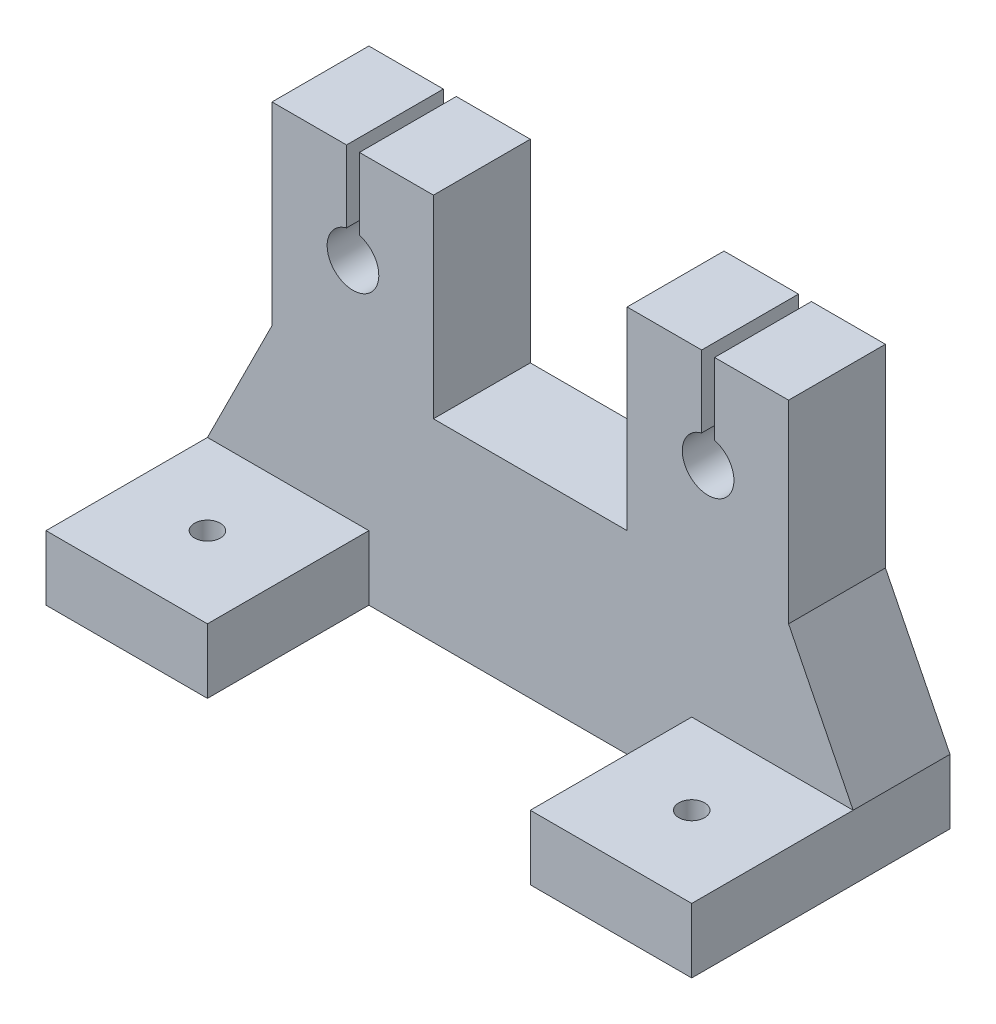
ISO-10303-21;
HEADER;
FILE_DESCRIPTION(('STEP AP214'),'2;1');
FILE_NAME('part.step','',(''),(''),'','','');
FILE_SCHEMA(('AUTOMOTIVE_DESIGN { 1 0 10303 214 1 1 1 1 }'));
ENDSEC;
DATA;
#1=APPLICATION_CONTEXT('core data for automotive mechanical design processes');
#2=APPLICATION_PROTOCOL_DEFINITION('international standard','automotive_design',2000,#1);
#3=PRODUCT_CONTEXT('',#1,'mechanical');
#4=PRODUCT('Part','Part','',(#3));
#5=PRODUCT_RELATED_PRODUCT_CATEGORY('part','',(#4));
#6=PRODUCT_DEFINITION_FORMATION('','',#4);
#7=PRODUCT_DEFINITION_CONTEXT('part definition',#1,'design');
#8=PRODUCT_DEFINITION('design','',#6,#7);
#9=PRODUCT_DEFINITION_SHAPE('','',#8);
#10=(LENGTH_UNIT() NAMED_UNIT(*) SI_UNIT(.MILLI.,.METRE.));
#11=(NAMED_UNIT(*) PLANE_ANGLE_UNIT() SI_UNIT($,.RADIAN.));
#12=(NAMED_UNIT(*) SI_UNIT($,.STERADIAN.) SOLID_ANGLE_UNIT());
#13=UNCERTAINTY_MEASURE_WITH_UNIT(LENGTH_MEASURE(1.E-05),#10,'distance_accuracy_value','');
#14=(GEOMETRIC_REPRESENTATION_CONTEXT(3) GLOBAL_UNCERTAINTY_ASSIGNED_CONTEXT((#13)) GLOBAL_UNIT_ASSIGNED_CONTEXT((#10,
#11,#12)) REPRESENTATION_CONTEXT('',''));
#15=CARTESIAN_POINT('',(0.,0.,0.));
#16=DIRECTION('',(0.,0.,1.));
#17=DIRECTION('',(1.,0.,0.));
#18=AXIS2_PLACEMENT_3D('',#15,#16,#17);
#19=CARTESIAN_POINT('',(27.5400295448925,15.,0.));
#20=DIRECTION('',(0.,0.,1.));
#21=DIRECTION('',(1.,0.,0.));
#22=AXIS2_PLACEMENT_3D('',#19,#20,#21);
#23=PLANE('',#22);
#24=DIRECTION('',(0.,-1.,0.));
#25=VECTOR('',#24,1.);
#26=CARTESIAN_POINT('',(25.,-20.,0.));
#27=LINE('',#26,#25);
#28=CARTESIAN_POINT('',(25.,-20.,0.));
#29=VERTEX_POINT('',#28);
#30=CARTESIAN_POINT('',(25.,-30.,0.));
#31=VERTEX_POINT('',#30);
#32=EDGE_CURVE('E55',#29,#31,#27,.T.);
#33=ORIENTED_EDGE('',*,*,#32,.F.);
#34=DIRECTION('',(-1.,0.,0.));
#35=VECTOR('',#34,1.);
#36=CARTESIAN_POINT('',(50.,-20.,0.));
#37=LINE('',#36,#35);
#38=CARTESIAN_POINT('',(50.,-20.,0.));
#39=VERTEX_POINT('',#38);
#40=EDGE_CURVE('E467',#39,#29,#37,.T.);
#41=ORIENTED_EDGE('',*,*,#40,.F.);
#42=DIRECTION('',(-0.447213595499958,0.894427190999916,0.));
#43=VECTOR('',#42,1.);
#44=CARTESIAN_POINT('',(40.,0.,0.));
#45=LINE('',#44,#43);
#46=CARTESIAN_POINT('',(40.,0.,0.));
#47=VERTEX_POINT('',#46);
#48=EDGE_CURVE('E345',#39,#47,#45,.T.);
#49=ORIENTED_EDGE('',*,*,#48,.T.);
#50=DIRECTION('',(0.,1.,0.));
#51=VECTOR('',#50,1.);
#52=CARTESIAN_POINT('',(40.,0.,0.));
#53=LINE('',#52,#51);
#54=CARTESIAN_POINT('',(40.,30.,0.));
#55=VERTEX_POINT('',#54);
#56=EDGE_CURVE('E348',#47,#55,#53,.T.);
#57=ORIENTED_EDGE('',*,*,#56,.T.);
#58=DIRECTION('',(-1.,0.,0.));
#59=VECTOR('',#58,1.);
#60=CARTESIAN_POINT('',(28.5400295448926,30.,0.));
#61=LINE('',#60,#59);
#62=CARTESIAN_POINT('',(28.5400295448926,30.,0.));
#63=VERTEX_POINT('',#62);
#64=EDGE_CURVE('E351',#55,#63,#61,.T.);
#65=ORIENTED_EDGE('',*,*,#64,.T.);
#66=DIRECTION('',(0.,-1.,0.));
#67=VECTOR('',#66,1.);
#68=CARTESIAN_POINT('',(28.5400295448926,30.,0.));
#69=LINE('',#68,#67);
#70=CARTESIAN_POINT('',(28.5400295448926,18.8729833462074,0.));
#71=VERTEX_POINT('',#70);
#72=EDGE_CURVE('E354',#63,#71,#69,.T.);
#73=ORIENTED_EDGE('',*,*,#72,.T.);
#74=CARTESIAN_POINT('',(27.5400295448925,15.,0.));
#75=DIRECTION('',(0.,0.,-1.));
#76=DIRECTION('',(1.,0.,0.));
#77=AXIS2_PLACEMENT_3D('',#74,#75,#76);
#78=CIRCLE('',#77,4.00000000000001);
#79=CARTESIAN_POINT('',(26.5400295448926,18.8729833462074,0.));
#80=VERTEX_POINT('',#79);
#81=EDGE_CURVE('E357',#71,#80,#78,.T.);
#82=ORIENTED_EDGE('',*,*,#81,.T.);
#83=DIRECTION('',(0.,1.,0.));
#84=VECTOR('',#83,1.);
#85=CARTESIAN_POINT('',(26.5400295448926,30.,0.));
#86=LINE('',#85,#84);
#87=CARTESIAN_POINT('',(26.5400295448926,30.,0.));
#88=VERTEX_POINT('',#87);
#89=EDGE_CURVE('E360',#80,#88,#86,.T.);
#90=ORIENTED_EDGE('',*,*,#89,.T.);
#91=DIRECTION('',(-1.,0.,0.));
#92=VECTOR('',#91,1.);
#93=CARTESIAN_POINT('',(15.,30.,0.));
#94=LINE('',#93,#92);
#95=CARTESIAN_POINT('',(15.,30.,0.));
#96=VERTEX_POINT('',#95);
#97=EDGE_CURVE('E363',#88,#96,#94,.T.);
#98=ORIENTED_EDGE('',*,*,#97,.T.);
#99=DIRECTION('',(0.,-1.,0.));
#100=VECTOR('',#99,1.);
#101=CARTESIAN_POINT('',(15.,0.,0.));
#102=LINE('',#101,#100);
#103=CARTESIAN_POINT('',(15.,0.,0.));
#104=VERTEX_POINT('',#103);
#105=EDGE_CURVE('E263',#96,#104,#102,.T.);
#106=ORIENTED_EDGE('',*,*,#105,.T.);
#107=DIRECTION('',(-1.,0.,0.));
#108=VECTOR('',#107,1.);
#109=CARTESIAN_POINT('',(-15.,0.,0.));
#110=LINE('',#109,#108);
#111=CARTESIAN_POINT('',(-15.,0.,0.));
#112=VERTEX_POINT('',#111);
#113=EDGE_CURVE('E259',#104,#112,#110,.T.);
#114=ORIENTED_EDGE('',*,*,#113,.T.);
#115=DIRECTION('',(0.,1.,0.));
#116=VECTOR('',#115,1.);
#117=CARTESIAN_POINT('',(-15.,0.,0.));
#118=LINE('',#117,#116);
#119=CARTESIAN_POINT('',(-15.,30.,0.));
#120=VERTEX_POINT('',#119);
#121=EDGE_CURVE('E320',#112,#120,#118,.T.);
#122=ORIENTED_EDGE('',*,*,#121,.T.);
#123=DIRECTION('',(-1.,0.,0.));
#124=VECTOR('',#123,1.);
#125=CARTESIAN_POINT('',(-26.4599704551074,30.,0.));
#126=LINE('',#125,#124);
#127=CARTESIAN_POINT('',(-26.4599704551074,30.,0.));
#128=VERTEX_POINT('',#127);
#129=EDGE_CURVE('E323',#120,#128,#126,.T.);
#130=ORIENTED_EDGE('',*,*,#129,.T.);
#131=DIRECTION('',(0.,-1.,0.));
#132=VECTOR('',#131,1.);
#133=CARTESIAN_POINT('',(-26.4599704551074,30.,0.));
#134=LINE('',#133,#132);
#135=CARTESIAN_POINT('',(-26.4599704551074,18.8729833462074,0.));
#136=VERTEX_POINT('',#135);
#137=EDGE_CURVE('E326',#128,#136,#134,.T.);
#138=ORIENTED_EDGE('',*,*,#137,.T.);
#139=CARTESIAN_POINT('',(-27.4599704551074,15.,0.));
#140=DIRECTION('',(0.,0.,-1.));
#141=DIRECTION('',(1.,0.,0.));
#142=AXIS2_PLACEMENT_3D('',#139,#140,#141);
#143=CIRCLE('',#142,4.);
#144=CARTESIAN_POINT('',(-28.4599704551074,18.8729833462074,0.));
#145=VERTEX_POINT('',#144);
#146=EDGE_CURVE('E329',#136,#145,#143,.T.);
#147=ORIENTED_EDGE('',*,*,#146,.T.);
#148=DIRECTION('',(0.,1.,0.));
#149=VECTOR('',#148,1.);
#150=CARTESIAN_POINT('',(-28.4599704551074,30.,0.));
#151=LINE('',#150,#149);
#152=CARTESIAN_POINT('',(-28.4599704551074,30.,0.));
#153=VERTEX_POINT('',#152);
#154=EDGE_CURVE('E332',#145,#153,#151,.T.);
#155=ORIENTED_EDGE('',*,*,#154,.T.);
#156=DIRECTION('',(-1.,0.,0.));
#157=VECTOR('',#156,1.);
#158=CARTESIAN_POINT('',(-40.,30.,0.));
#159=LINE('',#158,#157);
#160=CARTESIAN_POINT('',(-40.,30.,0.));
#161=VERTEX_POINT('',#160);
#162=EDGE_CURVE('E335',#153,#161,#159,.T.);
#163=ORIENTED_EDGE('',*,*,#162,.T.);
#164=DIRECTION('',(0.,-1.,0.));
#165=VECTOR('',#164,1.);
#166=CARTESIAN_POINT('',(-40.,0.,0.));
#167=LINE('',#166,#165);
#168=CARTESIAN_POINT('',(-40.,0.,0.));
#169=VERTEX_POINT('',#168);
#170=EDGE_CURVE('E338',#161,#169,#167,.T.);
#171=ORIENTED_EDGE('',*,*,#170,.T.);
#172=DIRECTION('',(-0.447213595499958,-0.894427190999916,0.));
#173=VECTOR('',#172,1.);
#174=CARTESIAN_POINT('',(-50.,-20.,0.));
#175=LINE('',#174,#173);
#176=CARTESIAN_POINT('',(-50.,-20.,0.));
#177=VERTEX_POINT('',#176);
#178=EDGE_CURVE('E341',#169,#177,#175,.T.);
#179=ORIENTED_EDGE('',*,*,#178,.T.);
#180=DIRECTION('',(-1.,0.,0.));
#181=VECTOR('',#180,1.);
#182=CARTESIAN_POINT('',(-50.,-20.,0.));
#183=LINE('',#182,#181);
#184=CARTESIAN_POINT('',(-25.,-20.,0.));
#185=VERTEX_POINT('',#184);
#186=EDGE_CURVE('E233',#185,#177,#183,.T.);
#187=ORIENTED_EDGE('',*,*,#186,.F.);
#188=DIRECTION('',(0.,1.,0.));
#189=VECTOR('',#188,1.);
#190=CARTESIAN_POINT('',(-25.,-20.,0.));
#191=LINE('',#190,#189);
#192=CARTESIAN_POINT('',(-25.,-30.,0.));
#193=VERTEX_POINT('',#192);
#194=EDGE_CURVE('E230',#193,#185,#191,.T.);
#195=ORIENTED_EDGE('',*,*,#194,.F.);
#196=DIRECTION('',(1.,0.,0.));
#197=VECTOR('',#196,1.);
#198=CARTESIAN_POINT('',(50.,-30.,0.));
#199=LINE('',#198,#197);
#200=EDGE_CURVE('E60',#193,#31,#199,.T.);
#201=ORIENTED_EDGE('',*,*,#200,.T.);
#202=EDGE_LOOP('',(#33,#41,#49,#57,#65,#73,#82,#90,#98,#106,#114,#122,#130,#138,#147,#155,#163,
#171,#179,#187,#195,#201));
#203=FACE_BOUND('',#202,.T.);
#204=ADVANCED_FACE('F38',(#203),#23,.T.);
#205=CARTESIAN_POINT('',(15.,0.,-15.));
#206=DIRECTION('',(-1.,0.,0.));
#207=DIRECTION('',(0.,0.,1.));
#208=AXIS2_PLACEMENT_3D('',#205,#206,#207);
#209=PLANE('',#208);
#210=ORIENTED_EDGE('',*,*,#105,.F.);
#211=DIRECTION('',(0.,0.,1.));
#212=VECTOR('',#211,1.);
#213=CARTESIAN_POINT('',(15.,30.,-15.));
#214=LINE('',#213,#212);
#215=CARTESIAN_POINT('',(15.,30.,-15.));
#216=VERTEX_POINT('',#215);
#217=EDGE_CURVE('E47',#216,#96,#214,.T.);
#218=ORIENTED_EDGE('',*,*,#217,.F.);
#219=DIRECTION('',(0.,-1.,0.));
#220=VECTOR('',#219,1.);
#221=CARTESIAN_POINT('',(15.,0.,-15.));
#222=LINE('',#221,#220);
#223=CARTESIAN_POINT('',(15.,0.,-15.));
#224=VERTEX_POINT('',#223);
#225=EDGE_CURVE('E315',#216,#224,#222,.T.);
#226=ORIENTED_EDGE('',*,*,#225,.T.);
#227=DIRECTION('',(0.,0.,1.));
#228=VECTOR('',#227,1.);
#229=CARTESIAN_POINT('',(15.,0.,-15.));
#230=LINE('',#229,#228);
#231=EDGE_CURVE('E11',#224,#104,#230,.T.);
#232=ORIENTED_EDGE('',*,*,#231,.T.);
#233=EDGE_LOOP('',(#210,#218,#226,#232));
#234=FACE_BOUND('',#233,.T.);
#235=ADVANCED_FACE('F411',(#234),#209,.T.);
#236=CARTESIAN_POINT('',(15.,30.,-15.));
#237=DIRECTION('',(0.,1.,0.));
#238=DIRECTION('',(0.,0.,1.));
#239=AXIS2_PLACEMENT_3D('',#236,#237,#238);
#240=PLANE('',#239);
#241=ORIENTED_EDGE('',*,*,#97,.F.);
#242=DIRECTION('',(0.,0.,1.));
#243=VECTOR('',#242,1.);
#244=CARTESIAN_POINT('',(26.5400295448926,30.,-15.));
#245=LINE('',#244,#243);
#246=CARTESIAN_POINT('',(26.5400295448926,30.,-15.));
#247=VERTEX_POINT('',#246);
#248=EDGE_CURVE('E369',#247,#88,#245,.T.);
#249=ORIENTED_EDGE('',*,*,#248,.F.);
#250=DIRECTION('',(-1.,0.,0.));
#251=VECTOR('',#250,1.);
#252=CARTESIAN_POINT('',(15.,30.,-15.));
#253=LINE('',#252,#251);
#254=EDGE_CURVE('E312',#247,#216,#253,.T.);
#255=ORIENTED_EDGE('',*,*,#254,.T.);
#256=ORIENTED_EDGE('',*,*,#217,.T.);
#257=EDGE_LOOP('',(#241,#249,#255,#256));
#258=FACE_BOUND('',#257,.T.);
#259=ADVANCED_FACE('F505',(#258),#240,.T.);
#260=CARTESIAN_POINT('',(26.5400295448926,30.,-15.));
#261=DIRECTION('',(1.,0.,0.));
#262=DIRECTION('',(0.,0.,-1.));
#263=AXIS2_PLACEMENT_3D('',#260,#261,#262);
#264=PLANE('',#263);
#265=ORIENTED_EDGE('',*,*,#89,.F.);
#266=DIRECTION('',(0.,0.,1.));
#267=VECTOR('',#266,1.);
#268=CARTESIAN_POINT('',(26.5400295448926,18.8729833462074,-15.));
#269=LINE('',#268,#267);
#270=CARTESIAN_POINT('',(26.5400295448926,18.8729833462074,-15.));
#271=VERTEX_POINT('',#270);
#272=EDGE_CURVE('E371',#271,#80,#269,.T.);
#273=ORIENTED_EDGE('',*,*,#272,.F.);
#274=DIRECTION('',(0.,1.,0.));
#275=VECTOR('',#274,1.);
#276=CARTESIAN_POINT('',(26.5400295448926,30.,-15.));
#277=LINE('',#276,#275);
#278=EDGE_CURVE('E309',#271,#247,#277,.T.);
#279=ORIENTED_EDGE('',*,*,#278,.T.);
#280=ORIENTED_EDGE('',*,*,#248,.T.);
#281=EDGE_LOOP('',(#265,#273,#279,#280));
#282=FACE_BOUND('',#281,.T.);
#283=ADVANCED_FACE('F511',(#282),#264,.T.);
#284=CARTESIAN_POINT('',(27.5400295448925,15.,-15.));
#285=DIRECTION('',(0.,0.,1.));
#286=DIRECTION('',(1.,0.,0.));
#287=AXIS2_PLACEMENT_3D('',#284,#285,#286);
#288=CYLINDRICAL_SURFACE('',#287,4.00000000000001);
#289=ORIENTED_EDGE('',*,*,#81,.F.);
#290=DIRECTION('',(0.,0.,1.));
#291=VECTOR('',#290,1.);
#292=CARTESIAN_POINT('',(28.5400295448926,18.8729833462074,-15.));
#293=LINE('',#292,#291);
#294=CARTESIAN_POINT('',(28.5400295448926,18.8729833462074,-15.));
#295=VERTEX_POINT('',#294);
#296=EDGE_CURVE('E373',#295,#71,#293,.T.);
#297=ORIENTED_EDGE('',*,*,#296,.F.);
#298=CARTESIAN_POINT('',(27.5400295448925,15.,-15.));
#299=DIRECTION('',(0.,0.,-1.));
#300=DIRECTION('',(1.,0.,0.));
#301=AXIS2_PLACEMENT_3D('',#298,#299,#300);
#302=CIRCLE('',#301,4.00000000000001);
#303=EDGE_CURVE('E306',#295,#271,#302,.T.);
#304=ORIENTED_EDGE('',*,*,#303,.T.);
#305=ORIENTED_EDGE('',*,*,#272,.T.);
#306=EDGE_LOOP('',(#289,#297,#304,#305));
#307=FACE_BOUND('',#306,.T.);
#308=ADVANCED_FACE('F515',(#307),#288,.F.);
#309=CARTESIAN_POINT('',(28.5400295448926,30.,-15.));
#310=DIRECTION('',(-1.,0.,0.));
#311=DIRECTION('',(0.,0.,1.));
#312=AXIS2_PLACEMENT_3D('',#309,#310,#311);
#313=PLANE('',#312);
#314=ORIENTED_EDGE('',*,*,#72,.F.);
#315=DIRECTION('',(0.,0.,1.));
#316=VECTOR('',#315,1.);
#317=CARTESIAN_POINT('',(28.5400295448926,30.,-15.));
#318=LINE('',#317,#316);
#319=CARTESIAN_POINT('',(28.5400295448926,30.,-15.));
#320=VERTEX_POINT('',#319);
#321=EDGE_CURVE('E375',#320,#63,#318,.T.);
#322=ORIENTED_EDGE('',*,*,#321,.F.);
#323=DIRECTION('',(0.,-1.,0.));
#324=VECTOR('',#323,1.);
#325=CARTESIAN_POINT('',(28.5400295448926,30.,-15.));
#326=LINE('',#325,#324);
#327=EDGE_CURVE('E303',#320,#295,#326,.T.);
#328=ORIENTED_EDGE('',*,*,#327,.T.);
#329=ORIENTED_EDGE('',*,*,#296,.T.);
#330=EDGE_LOOP('',(#314,#322,#328,#329));
#331=FACE_BOUND('',#330,.T.);
#332=ADVANCED_FACE('F519',(#331),#313,.T.);
#333=CARTESIAN_POINT('',(28.5400295448926,30.,-15.));
#334=DIRECTION('',(0.,1.,0.));
#335=DIRECTION('',(0.,0.,1.));
#336=AXIS2_PLACEMENT_3D('',#333,#334,#335);
#337=PLANE('',#336);
#338=ORIENTED_EDGE('',*,*,#64,.F.);
#339=DIRECTION('',(0.,0.,1.));
#340=VECTOR('',#339,1.);
#341=CARTESIAN_POINT('',(40.,30.,-15.));
#342=LINE('',#341,#340);
#343=CARTESIAN_POINT('',(40.,30.,-15.));
#344=VERTEX_POINT('',#343);
#345=EDGE_CURVE('E377',#344,#55,#342,.T.);
#346=ORIENTED_EDGE('',*,*,#345,.F.);
#347=DIRECTION('',(-1.,0.,0.));
#348=VECTOR('',#347,1.);
#349=CARTESIAN_POINT('',(28.5400295448926,30.,-15.));
#350=LINE('',#349,#348);
#351=EDGE_CURVE('E300',#344,#320,#350,.T.);
#352=ORIENTED_EDGE('',*,*,#351,.T.);
#353=ORIENTED_EDGE('',*,*,#321,.T.);
#354=EDGE_LOOP('',(#338,#346,#352,#353));
#355=FACE_BOUND('',#354,.T.);
#356=ADVANCED_FACE('F523',(#355),#337,.T.);
#357=CARTESIAN_POINT('',(40.,0.,-15.));
#358=DIRECTION('',(1.,0.,0.));
#359=DIRECTION('',(0.,0.,-1.));
#360=AXIS2_PLACEMENT_3D('',#357,#358,#359);
#361=PLANE('',#360);
#362=ORIENTED_EDGE('',*,*,#56,.F.);
#363=DIRECTION('',(0.,0.,1.));
#364=VECTOR('',#363,1.);
#365=CARTESIAN_POINT('',(40.,0.,-15.));
#366=LINE('',#365,#364);
#367=CARTESIAN_POINT('',(40.,0.,-15.));
#368=VERTEX_POINT('',#367);
#369=EDGE_CURVE('E379',#368,#47,#366,.T.);
#370=ORIENTED_EDGE('',*,*,#369,.F.);
#371=DIRECTION('',(0.,1.,0.));
#372=VECTOR('',#371,1.);
#373=CARTESIAN_POINT('',(40.,0.,-15.));
#374=LINE('',#373,#372);
#375=EDGE_CURVE('E297',#368,#344,#374,.T.);
#376=ORIENTED_EDGE('',*,*,#375,.T.);
#377=ORIENTED_EDGE('',*,*,#345,.T.);
#378=EDGE_LOOP('',(#362,#370,#376,#377));
#379=FACE_BOUND('',#378,.T.);
#380=ADVANCED_FACE('F527',(#379),#361,.T.);
#381=CARTESIAN_POINT('',(40.,0.,-15.));
#382=DIRECTION('',(0.894427190999916,0.447213595499958,0.));
#383=DIRECTION('',(-0.447213595499958,0.894427190999916,0.));
#384=AXIS2_PLACEMENT_3D('',#381,#382,#383);
#385=PLANE('',#384);
#386=ORIENTED_EDGE('',*,*,#48,.F.);
#387=DIRECTION('',(0.,0.,1.));
#388=VECTOR('',#387,1.);
#389=CARTESIAN_POINT('',(50.,-20.,-15.));
#390=LINE('',#389,#388);
#391=CARTESIAN_POINT('',(50.,-20.,-15.));
#392=VERTEX_POINT('',#391);
#393=EDGE_CURVE('E228',#392,#39,#390,.T.);
#394=ORIENTED_EDGE('',*,*,#393,.F.);
#395=DIRECTION('',(-0.447213595499958,0.894427190999916,0.));
#396=VECTOR('',#395,1.);
#397=CARTESIAN_POINT('',(40.,0.,-15.));
#398=LINE('',#397,#396);
#399=EDGE_CURVE('E294',#392,#368,#398,.T.);
#400=ORIENTED_EDGE('',*,*,#399,.T.);
#401=ORIENTED_EDGE('',*,*,#369,.T.);
#402=EDGE_LOOP('',(#386,#394,#400,#401));
#403=FACE_BOUND('',#402,.T.);
#404=ADVANCED_FACE('F531',(#403),#385,.T.);
#405=CARTESIAN_POINT('',(50.,-20.,-15.));
#406=DIRECTION('',(1.,0.,0.));
#407=DIRECTION('',(0.,1.,0.));
#408=AXIS2_PLACEMENT_3D('',#405,#406,#407);
#409=PLANE('',#408);
#410=ORIENTED_EDGE('',*,*,#393,.T.);
#411=DIRECTION('',(0.,0.,-1.));
#412=VECTOR('',#411,1.);
#413=CARTESIAN_POINT('',(50.,-20.,25.));
#414=LINE('',#413,#412);
#415=CARTESIAN_POINT('',(50.,-20.,25.));
#416=VERTEX_POINT('',#415);
#417=EDGE_CURVE('E209',#416,#39,#414,.T.);
#418=ORIENTED_EDGE('',*,*,#417,.F.);
#419=DIRECTION('',(0.,1.,0.));
#420=VECTOR('',#419,1.);
#421=CARTESIAN_POINT('',(50.,-30.,25.));
#422=LINE('',#421,#420);
#423=CARTESIAN_POINT('',(50.,-30.,25.));
#424=VERTEX_POINT('',#423);
#425=EDGE_CURVE('E215',#424,#416,#422,.T.);
#426=ORIENTED_EDGE('',*,*,#425,.F.);
#427=DIRECTION('',(0.,0.,1.));
#428=VECTOR('',#427,1.);
#429=CARTESIAN_POINT('',(50.,-30.,-15.));
#430=LINE('',#429,#428);
#431=CARTESIAN_POINT('',(50.,-30.,-15.));
#432=VERTEX_POINT('',#431);
#433=EDGE_CURVE('E382',#432,#424,#430,.T.);
#434=ORIENTED_EDGE('',*,*,#433,.F.);
#435=DIRECTION('',(0.,1.,0.));
#436=VECTOR('',#435,1.);
#437=CARTESIAN_POINT('',(50.,-20.,-15.));
#438=LINE('',#437,#436);
#439=EDGE_CURVE('E292',#432,#392,#438,.T.);
#440=ORIENTED_EDGE('',*,*,#439,.T.);
#441=EDGE_LOOP('',(#410,#418,#426,#434,#440));
#442=FACE_BOUND('',#441,.T.);
#443=ADVANCED_FACE('F226',(#442),#409,.T.);
#444=CARTESIAN_POINT('',(50.,-30.,-15.));
#445=DIRECTION('',(0.,-1.,0.));
#446=DIRECTION('',(1.,0.,0.));
#447=AXIS2_PLACEMENT_3D('',#444,#445,#446);
#448=PLANE('',#447);
#449=CARTESIAN_POINT('',(-37.5,-30.,12.5));
#450=DIRECTION('',(0.,1.,0.));
#451=DIRECTION('',(0.,0.,1.));
#452=AXIS2_PLACEMENT_3D('',#449,#450,#451);
#453=CIRCLE('',#452,2.);
#454=CARTESIAN_POINT('',(-37.5,-30.,14.5));
#455=VERTEX_POINT('',#454);
#456=EDGE_CURVE('E468',#455,#455,#453,.T.);
#457=ORIENTED_EDGE('',*,*,#456,.T.);
#458=EDGE_LOOP('',(#457));
#459=FACE_BOUND('',#458,.T.);
#460=CARTESIAN_POINT('',(37.5,-30.,12.5));
#461=DIRECTION('',(0.,1.,0.));
#462=DIRECTION('',(0.,0.,1.));
#463=AXIS2_PLACEMENT_3D('',#460,#461,#462);
#464=CIRCLE('',#463,2.);
#465=CARTESIAN_POINT('',(37.5,-30.,14.5));
#466=VERTEX_POINT('',#465);
#467=EDGE_CURVE('E474',#466,#466,#464,.T.);
#468=ORIENTED_EDGE('',*,*,#467,.T.);
#469=EDGE_LOOP('',(#468));
#470=FACE_BOUND('',#469,.T.);
#471=ORIENTED_EDGE('',*,*,#200,.F.);
#472=DIRECTION('',(0.,0.,-1.));
#473=VECTOR('',#472,1.);
#474=CARTESIAN_POINT('',(-25.,-30.,25.));
#475=LINE('',#474,#473);
#476=CARTESIAN_POINT('',(-25.,-30.,25.));
#477=VERTEX_POINT('',#476);
#478=EDGE_CURVE('E256',#477,#193,#475,.T.);
#479=ORIENTED_EDGE('',*,*,#478,.F.);
#480=DIRECTION('',(1.,0.,0.));
#481=VECTOR('',#480,1.);
#482=CARTESIAN_POINT('',(-50.,-30.,25.));
#483=LINE('',#482,#481);
#484=CARTESIAN_POINT('',(-50.,-30.,25.));
#485=VERTEX_POINT('',#484);
#486=EDGE_CURVE('E242',#485,#477,#483,.T.);
#487=ORIENTED_EDGE('',*,*,#486,.F.);
#488=DIRECTION('',(0.,0.,1.));
#489=VECTOR('',#488,1.);
#490=CARTESIAN_POINT('',(-50.,-30.,-15.));
#491=LINE('',#490,#489);
#492=CARTESIAN_POINT('',(-50.,-30.,-15.));
#493=VERTEX_POINT('',#492);
#494=EDGE_CURVE('E384',#493,#485,#491,.T.);
#495=ORIENTED_EDGE('',*,*,#494,.F.);
#496=DIRECTION('',(1.,0.,0.));
#497=VECTOR('',#496,1.);
#498=CARTESIAN_POINT('',(0.,-30.,-15.));
#499=LINE('',#498,#497);
#500=EDGE_CURVE('E290',#493,#432,#499,.T.);
#501=ORIENTED_EDGE('',*,*,#500,.T.);
#502=ORIENTED_EDGE('',*,*,#433,.T.);
#503=DIRECTION('',(1.,0.,0.));
#504=VECTOR('',#503,1.);
#505=CARTESIAN_POINT('',(25.,-30.,25.));
#506=LINE('',#505,#504);
#507=CARTESIAN_POINT('',(25.,-30.,25.));
#508=VERTEX_POINT('',#507);
#509=EDGE_CURVE('E221',#508,#424,#506,.T.);
#510=ORIENTED_EDGE('',*,*,#509,.F.);
#511=DIRECTION('',(0.,0.,-1.));
#512=VECTOR('',#511,1.);
#513=CARTESIAN_POINT('',(25.,-30.,25.));
#514=LINE('',#513,#512);
#515=EDGE_CURVE('E235',#508,#31,#514,.T.);
#516=ORIENTED_EDGE('',*,*,#515,.T.);
#517=EDGE_LOOP('',(#471,#479,#487,#495,#501,#502,#510,#516));
#518=FACE_BOUND('',#517,.T.);
#519=ADVANCED_FACE('F461',(#459,#470,#518),#448,.T.);
#520=CARTESIAN_POINT('',(-50.,-30.,-15.));
#521=DIRECTION('',(-1.,0.,0.));
#522=DIRECTION('',(0.,0.,1.));
#523=AXIS2_PLACEMENT_3D('',#520,#521,#522);
#524=PLANE('',#523);
#525=ORIENTED_EDGE('',*,*,#494,.T.);
#526=DIRECTION('',(0.,-1.,0.));
#527=VECTOR('',#526,1.);
#528=CARTESIAN_POINT('',(-50.,-20.,25.));
#529=LINE('',#528,#527);
#530=CARTESIAN_POINT('',(-50.,-20.,25.));
#531=VERTEX_POINT('',#530);
#532=EDGE_CURVE('E239',#531,#485,#529,.T.);
#533=ORIENTED_EDGE('',*,*,#532,.F.);
#534=DIRECTION('',(0.,0.,-1.));
#535=VECTOR('',#534,1.);
#536=CARTESIAN_POINT('',(-50.,-20.,25.));
#537=LINE('',#536,#535);
#538=EDGE_CURVE('E247',#531,#177,#537,.T.);
#539=ORIENTED_EDGE('',*,*,#538,.T.);
#540=DIRECTION('',(0.,0.,1.));
#541=VECTOR('',#540,1.);
#542=CARTESIAN_POINT('',(-50.,-20.,-15.));
#543=LINE('',#542,#541);
#544=CARTESIAN_POINT('',(-50.,-20.,-15.));
#545=VERTEX_POINT('',#544);
#546=EDGE_CURVE('E386',#545,#177,#543,.T.);
#547=ORIENTED_EDGE('',*,*,#546,.F.);
#548=DIRECTION('',(0.,-1.,0.));
#549=VECTOR('',#548,1.);
#550=CARTESIAN_POINT('',(-50.,-30.,-15.));
#551=LINE('',#550,#549);
#552=EDGE_CURVE('E287',#545,#493,#551,.T.);
#553=ORIENTED_EDGE('',*,*,#552,.T.);
#554=EDGE_LOOP('',(#525,#533,#539,#547,#553));
#555=FACE_BOUND('',#554,.T.);
#556=ADVANCED_FACE('F450',(#555),#524,.T.);
#557=CARTESIAN_POINT('',(-50.,-20.,-15.));
#558=DIRECTION('',(-0.894427190999916,0.447213595499958,0.));
#559=DIRECTION('',(-0.447213595499958,-0.894427190999916,0.));
#560=AXIS2_PLACEMENT_3D('',#557,#558,#559);
#561=PLANE('',#560);
#562=ORIENTED_EDGE('',*,*,#178,.F.);
#563=DIRECTION('',(0.,0.,1.));
#564=VECTOR('',#563,1.);
#565=CARTESIAN_POINT('',(-40.,0.,-15.));
#566=LINE('',#565,#564);
#567=CARTESIAN_POINT('',(-40.,0.,-15.));
#568=VERTEX_POINT('',#567);
#569=EDGE_CURVE('E388',#568,#169,#566,.T.);
#570=ORIENTED_EDGE('',*,*,#569,.F.);
#571=DIRECTION('',(-0.447213595499958,-0.894427190999916,0.));
#572=VECTOR('',#571,1.);
#573=CARTESIAN_POINT('',(-50.,-20.,-15.));
#574=LINE('',#573,#572);
#575=EDGE_CURVE('E284',#568,#545,#574,.T.);
#576=ORIENTED_EDGE('',*,*,#575,.T.);
#577=ORIENTED_EDGE('',*,*,#546,.T.);
#578=EDGE_LOOP('',(#562,#570,#576,#577));
#579=FACE_BOUND('',#578,.T.);
#580=ADVANCED_FACE('F442',(#579),#561,.T.);
#581=CARTESIAN_POINT('',(-40.,0.,-15.));
#582=DIRECTION('',(-1.,0.,0.));
#583=DIRECTION('',(0.,-1.,0.));
#584=AXIS2_PLACEMENT_3D('',#581,#582,#583);
#585=PLANE('',#584);
#586=ORIENTED_EDGE('',*,*,#170,.F.);
#587=DIRECTION('',(0.,0.,1.));
#588=VECTOR('',#587,1.);
#589=CARTESIAN_POINT('',(-40.,30.,-15.));
#590=LINE('',#589,#588);
#591=CARTESIAN_POINT('',(-40.,30.,-15.));
#592=VERTEX_POINT('',#591);
#593=EDGE_CURVE('E390',#592,#161,#590,.T.);
#594=ORIENTED_EDGE('',*,*,#593,.F.);
#595=DIRECTION('',(0.,-1.,0.));
#596=VECTOR('',#595,1.);
#597=CARTESIAN_POINT('',(-40.,0.,-15.));
#598=LINE('',#597,#596);
#599=EDGE_CURVE('E281',#592,#568,#598,.T.);
#600=ORIENTED_EDGE('',*,*,#599,.T.);
#601=ORIENTED_EDGE('',*,*,#569,.T.);
#602=EDGE_LOOP('',(#586,#594,#600,#601));
#603=FACE_BOUND('',#602,.T.);
#604=ADVANCED_FACE('F438',(#603),#585,.T.);
#605=CARTESIAN_POINT('',(-40.,30.,-15.));
#606=DIRECTION('',(0.,1.,0.));
#607=DIRECTION('',(0.,0.,1.));
#608=AXIS2_PLACEMENT_3D('',#605,#606,#607);
#609=PLANE('',#608);
#610=ORIENTED_EDGE('',*,*,#162,.F.);
#611=DIRECTION('',(0.,0.,1.));
#612=VECTOR('',#611,1.);
#613=CARTESIAN_POINT('',(-28.4599704551074,30.,-15.));
#614=LINE('',#613,#612);
#615=CARTESIAN_POINT('',(-28.4599704551074,30.,-15.));
#616=VERTEX_POINT('',#615);
#617=EDGE_CURVE('E392',#616,#153,#614,.T.);
#618=ORIENTED_EDGE('',*,*,#617,.F.);
#619=DIRECTION('',(-1.,0.,0.));
#620=VECTOR('',#619,1.);
#621=CARTESIAN_POINT('',(-40.,30.,-15.));
#622=LINE('',#621,#620);
#623=EDGE_CURVE('E278',#616,#592,#622,.T.);
#624=ORIENTED_EDGE('',*,*,#623,.T.);
#625=ORIENTED_EDGE('',*,*,#593,.T.);
#626=EDGE_LOOP('',(#610,#618,#624,#625));
#627=FACE_BOUND('',#626,.T.);
#628=ADVANCED_FACE('F434',(#627),#609,.T.);
#629=CARTESIAN_POINT('',(-28.4599704551074,30.,-15.));
#630=DIRECTION('',(1.,0.,0.));
#631=DIRECTION('',(0.,0.,-1.));
#632=AXIS2_PLACEMENT_3D('',#629,#630,#631);
#633=PLANE('',#632);
#634=ORIENTED_EDGE('',*,*,#154,.F.);
#635=DIRECTION('',(0.,0.,1.));
#636=VECTOR('',#635,1.);
#637=CARTESIAN_POINT('',(-28.4599704551074,18.8729833462074,-15.));
#638=LINE('',#637,#636);
#639=CARTESIAN_POINT('',(-28.4599704551074,18.8729833462074,-15.));
#640=VERTEX_POINT('',#639);
#641=EDGE_CURVE('E394',#640,#145,#638,.T.);
#642=ORIENTED_EDGE('',*,*,#641,.F.);
#643=DIRECTION('',(0.,1.,0.));
#644=VECTOR('',#643,1.);
#645=CARTESIAN_POINT('',(-28.4599704551074,30.,-15.));
#646=LINE('',#645,#644);
#647=EDGE_CURVE('E275',#640,#616,#646,.T.);
#648=ORIENTED_EDGE('',*,*,#647,.T.);
#649=ORIENTED_EDGE('',*,*,#617,.T.);
#650=EDGE_LOOP('',(#634,#642,#648,#649));
#651=FACE_BOUND('',#650,.T.);
#652=ADVANCED_FACE('F430',(#651),#633,.T.);
#653=CARTESIAN_POINT('',(-27.4599704551074,15.,-15.));
#654=DIRECTION('',(0.,0.,1.));
#655=DIRECTION('',(1.,0.,0.));
#656=AXIS2_PLACEMENT_3D('',#653,#654,#655);
#657=CYLINDRICAL_SURFACE('',#656,4.);
#658=ORIENTED_EDGE('',*,*,#146,.F.);
#659=DIRECTION('',(0.,0.,1.));
#660=VECTOR('',#659,1.);
#661=CARTESIAN_POINT('',(-26.4599704551074,18.8729833462074,-15.));
#662=LINE('',#661,#660);
#663=CARTESIAN_POINT('',(-26.4599704551074,18.8729833462074,-15.));
#664=VERTEX_POINT('',#663);
#665=EDGE_CURVE('E396',#664,#136,#662,.T.);
#666=ORIENTED_EDGE('',*,*,#665,.F.);
#667=CARTESIAN_POINT('',(-27.4599704551074,15.,-15.));
#668=DIRECTION('',(0.,0.,-1.));
#669=DIRECTION('',(1.,0.,0.));
#670=AXIS2_PLACEMENT_3D('',#667,#668,#669);
#671=CIRCLE('',#670,4.);
#672=EDGE_CURVE('E272',#664,#640,#671,.T.);
#673=ORIENTED_EDGE('',*,*,#672,.T.);
#674=ORIENTED_EDGE('',*,*,#641,.T.);
#675=EDGE_LOOP('',(#658,#666,#673,#674));
#676=FACE_BOUND('',#675,.T.);
#677=ADVANCED_FACE('F426',(#676),#657,.F.);
#678=CARTESIAN_POINT('',(-26.4599704551074,30.,-15.));
#679=DIRECTION('',(-1.,0.,0.));
#680=DIRECTION('',(0.,0.,1.));
#681=AXIS2_PLACEMENT_3D('',#678,#679,#680);
#682=PLANE('',#681);
#683=ORIENTED_EDGE('',*,*,#137,.F.);
#684=DIRECTION('',(0.,0.,1.));
#685=VECTOR('',#684,1.);
#686=CARTESIAN_POINT('',(-26.4599704551074,30.,-15.));
#687=LINE('',#686,#685);
#688=CARTESIAN_POINT('',(-26.4599704551074,30.,-15.));
#689=VERTEX_POINT('',#688);
#690=EDGE_CURVE('E398',#689,#128,#687,.T.);
#691=ORIENTED_EDGE('',*,*,#690,.F.);
#692=DIRECTION('',(0.,-1.,0.));
#693=VECTOR('',#692,1.);
#694=CARTESIAN_POINT('',(-26.4599704551074,30.,-15.));
#695=LINE('',#694,#693);
#696=EDGE_CURVE('E269',#689,#664,#695,.T.);
#697=ORIENTED_EDGE('',*,*,#696,.T.);
#698=ORIENTED_EDGE('',*,*,#665,.T.);
#699=EDGE_LOOP('',(#683,#691,#697,#698));
#700=FACE_BOUND('',#699,.T.);
#701=ADVANCED_FACE('F424',(#700),#682,.T.);
#702=CARTESIAN_POINT('',(-26.4599704551074,30.,-15.));
#703=DIRECTION('',(0.,1.,0.));
#704=DIRECTION('',(0.,0.,1.));
#705=AXIS2_PLACEMENT_3D('',#702,#703,#704);
#706=PLANE('',#705);
#707=ORIENTED_EDGE('',*,*,#129,.F.);
#708=DIRECTION('',(0.,0.,1.));
#709=VECTOR('',#708,1.);
#710=CARTESIAN_POINT('',(-15.,30.,-15.));
#711=LINE('',#710,#709);
#712=CARTESIAN_POINT('',(-15.,30.,-15.));
#713=VERTEX_POINT('',#712);
#714=EDGE_CURVE('E399',#713,#120,#711,.T.);
#715=ORIENTED_EDGE('',*,*,#714,.F.);
#716=DIRECTION('',(-1.,0.,0.));
#717=VECTOR('',#716,1.);
#718=CARTESIAN_POINT('',(-26.4599704551074,30.,-15.));
#719=LINE('',#718,#717);
#720=EDGE_CURVE('E266',#713,#689,#719,.T.);
#721=ORIENTED_EDGE('',*,*,#720,.T.);
#722=ORIENTED_EDGE('',*,*,#690,.T.);
#723=EDGE_LOOP('',(#707,#715,#721,#722));
#724=FACE_BOUND('',#723,.T.);
#725=ADVANCED_FACE('F420',(#724),#706,.T.);
#726=CARTESIAN_POINT('',(-15.,0.,-15.));
#727=DIRECTION('',(1.,0.,0.));
#728=DIRECTION('',(0.,0.,-1.));
#729=AXIS2_PLACEMENT_3D('',#726,#727,#728);
#730=PLANE('',#729);
#731=ORIENTED_EDGE('',*,*,#121,.F.);
#732=DIRECTION('',(0.,0.,1.));
#733=VECTOR('',#732,1.);
#734=CARTESIAN_POINT('',(-15.,0.,-15.));
#735=LINE('',#734,#733);
#736=CARTESIAN_POINT('',(-15.,0.,-15.));
#737=VERTEX_POINT('',#736);
#738=EDGE_CURVE('E42',#737,#112,#735,.T.);
#739=ORIENTED_EDGE('',*,*,#738,.F.);
#740=DIRECTION('',(0.,1.,0.));
#741=VECTOR('',#740,1.);
#742=CARTESIAN_POINT('',(-15.,0.,-15.));
#743=LINE('',#742,#741);
#744=EDGE_CURVE('E262',#737,#713,#743,.T.);
#745=ORIENTED_EDGE('',*,*,#744,.T.);
#746=ORIENTED_EDGE('',*,*,#714,.T.);
#747=EDGE_LOOP('',(#731,#739,#745,#746));
#748=FACE_BOUND('',#747,.T.);
#749=ADVANCED_FACE('F407',(#748),#730,.T.);
#750=CARTESIAN_POINT('',(-15.,0.,-15.));
#751=DIRECTION('',(0.,1.,0.));
#752=DIRECTION('',(0.,0.,1.));
#753=AXIS2_PLACEMENT_3D('',#750,#751,#752);
#754=PLANE('',#753);
#755=ORIENTED_EDGE('',*,*,#113,.F.);
#756=ORIENTED_EDGE('',*,*,#231,.F.);
#757=DIRECTION('',(-1.,0.,0.));
#758=VECTOR('',#757,1.);
#759=CARTESIAN_POINT('',(0.,0.,-15.));
#760=LINE('',#759,#758);
#761=EDGE_CURVE('E260',#224,#737,#760,.T.);
#762=ORIENTED_EDGE('',*,*,#761,.T.);
#763=ORIENTED_EDGE('',*,*,#738,.T.);
#764=EDGE_LOOP('',(#755,#756,#762,#763));
#765=FACE_BOUND('',#764,.T.);
#766=ADVANCED_FACE('F40',(#765),#754,.T.);
#767=CARTESIAN_POINT('',(27.5400295448925,15.,-15.));
#768=DIRECTION('',(0.,0.,1.));
#769=DIRECTION('',(1.,0.,0.));
#770=AXIS2_PLACEMENT_3D('',#767,#768,#769);
#771=PLANE('',#770);
#772=ORIENTED_EDGE('',*,*,#761,.F.);
#773=ORIENTED_EDGE('',*,*,#225,.F.);
#774=ORIENTED_EDGE('',*,*,#254,.F.);
#775=ORIENTED_EDGE('',*,*,#278,.F.);
#776=ORIENTED_EDGE('',*,*,#303,.F.);
#777=ORIENTED_EDGE('',*,*,#327,.F.);
#778=ORIENTED_EDGE('',*,*,#351,.F.);
#779=ORIENTED_EDGE('',*,*,#375,.F.);
#780=ORIENTED_EDGE('',*,*,#399,.F.);
#781=ORIENTED_EDGE('',*,*,#439,.F.);
#782=ORIENTED_EDGE('',*,*,#500,.F.);
#783=ORIENTED_EDGE('',*,*,#552,.F.);
#784=ORIENTED_EDGE('',*,*,#575,.F.);
#785=ORIENTED_EDGE('',*,*,#599,.F.);
#786=ORIENTED_EDGE('',*,*,#623,.F.);
#787=ORIENTED_EDGE('',*,*,#647,.F.);
#788=ORIENTED_EDGE('',*,*,#672,.F.);
#789=ORIENTED_EDGE('',*,*,#696,.F.);
#790=ORIENTED_EDGE('',*,*,#720,.F.);
#791=ORIENTED_EDGE('',*,*,#744,.F.);
#792=EDGE_LOOP('',(#772,#773,#774,#775,#776,#777,#778,#779,#780,#781,#782,#783,#784,#785,#786,
#787,#788,#789,#790,#791));
#793=FACE_BOUND('',#792,.T.);
#794=ADVANCED_FACE('F414',(#793),#771,.F.);
#795=CARTESIAN_POINT('',(-25.,-20.,25.));
#796=DIRECTION('',(-1.,0.,0.));
#797=DIRECTION('',(0.,0.,1.));
#798=AXIS2_PLACEMENT_3D('',#795,#796,#797);
#799=PLANE('',#798);
#800=ORIENTED_EDGE('',*,*,#194,.T.);
#801=DIRECTION('',(0.,0.,-1.));
#802=VECTOR('',#801,1.);
#803=CARTESIAN_POINT('',(-25.,-20.,25.));
#804=LINE('',#803,#802);
#805=CARTESIAN_POINT('',(-25.,-20.,25.));
#806=VERTEX_POINT('',#805);
#807=EDGE_CURVE('E253',#806,#185,#804,.T.);
#808=ORIENTED_EDGE('',*,*,#807,.F.);
#809=DIRECTION('',(0.,1.,0.));
#810=VECTOR('',#809,1.);
#811=CARTESIAN_POINT('',(-25.,-20.,25.));
#812=LINE('',#811,#810);
#813=EDGE_CURVE('E244',#477,#806,#812,.T.);
#814=ORIENTED_EDGE('',*,*,#813,.F.);
#815=ORIENTED_EDGE('',*,*,#478,.T.);
#816=EDGE_LOOP('',(#800,#808,#814,#815));
#817=FACE_BOUND('',#816,.T.);
#818=ADVANCED_FACE('F458',(#817),#799,.F.);
#819=CARTESIAN_POINT('',(-50.,-20.,25.));
#820=DIRECTION('',(0.,-1.,0.));
#821=DIRECTION('',(0.,0.,-1.));
#822=AXIS2_PLACEMENT_3D('',#819,#820,#821);
#823=PLANE('',#822);
#824=CARTESIAN_POINT('',(-37.5,-20.,12.5));
#825=DIRECTION('',(0.,1.,0.));
#826=DIRECTION('',(0.,0.,1.));
#827=AXIS2_PLACEMENT_3D('',#824,#825,#826);
#828=CIRCLE('',#827,2.);
#829=CARTESIAN_POINT('',(-37.5,-20.,14.5));
#830=VERTEX_POINT('',#829);
#831=EDGE_CURVE('E477',#830,#830,#828,.T.);
#832=ORIENTED_EDGE('',*,*,#831,.F.);
#833=EDGE_LOOP('',(#832));
#834=FACE_BOUND('',#833,.T.);
#835=ORIENTED_EDGE('',*,*,#186,.T.);
#836=ORIENTED_EDGE('',*,*,#538,.F.);
#837=DIRECTION('',(-1.,0.,0.));
#838=VECTOR('',#837,1.);
#839=CARTESIAN_POINT('',(-50.,-20.,25.));
#840=LINE('',#839,#838);
#841=EDGE_CURVE('E246',#806,#531,#840,.T.);
#842=ORIENTED_EDGE('',*,*,#841,.F.);
#843=ORIENTED_EDGE('',*,*,#807,.T.);
#844=EDGE_LOOP('',(#835,#836,#842,#843));
#845=FACE_BOUND('',#844,.T.);
#846=ADVANCED_FACE('F445',(#834,#845),#823,.F.);
#847=CARTESIAN_POINT('',(0.,0.,25.));
#848=DIRECTION('',(0.,0.,1.));
#849=DIRECTION('',(1.,0.,0.));
#850=AXIS2_PLACEMENT_3D('',#847,#848,#849);
#851=PLANE('',#850);
#852=ORIENTED_EDGE('',*,*,#532,.T.);
#853=ORIENTED_EDGE('',*,*,#486,.T.);
#854=ORIENTED_EDGE('',*,*,#813,.T.);
#855=ORIENTED_EDGE('',*,*,#841,.T.);
#856=EDGE_LOOP('',(#852,#853,#854,#855));
#857=FACE_BOUND('',#856,.T.);
#858=ADVANCED_FACE('F454',(#857),#851,.T.);
#859=CARTESIAN_POINT('',(50.,-20.,25.));
#860=DIRECTION('',(0.,-1.,0.));
#861=DIRECTION('',(1.,0.,0.));
#862=AXIS2_PLACEMENT_3D('',#859,#860,#861);
#863=PLANE('',#862);
#864=CARTESIAN_POINT('',(37.5,-20.,12.5));
#865=DIRECTION('',(0.,1.,0.));
#866=DIRECTION('',(0.,0.,1.));
#867=AXIS2_PLACEMENT_3D('',#864,#865,#866);
#868=CIRCLE('',#867,2.);
#869=CARTESIAN_POINT('',(37.5,-20.,14.5));
#870=VERTEX_POINT('',#869);
#871=EDGE_CURVE('E471',#870,#870,#868,.T.);
#872=ORIENTED_EDGE('',*,*,#871,.F.);
#873=EDGE_LOOP('',(#872));
#874=FACE_BOUND('',#873,.T.);
#875=ORIENTED_EDGE('',*,*,#40,.T.);
#876=DIRECTION('',(0.,0.,-1.));
#877=VECTOR('',#876,1.);
#878=CARTESIAN_POINT('',(25.,-20.,25.));
#879=LINE('',#878,#877);
#880=CARTESIAN_POINT('',(25.,-20.,25.));
#881=VERTEX_POINT('',#880);
#882=EDGE_CURVE('E211',#881,#29,#879,.T.);
#883=ORIENTED_EDGE('',*,*,#882,.F.);
#884=DIRECTION('',(-1.,0.,0.));
#885=VECTOR('',#884,1.);
#886=CARTESIAN_POINT('',(50.,-20.,25.));
#887=LINE('',#886,#885);
#888=EDGE_CURVE('E205',#416,#881,#887,.T.);
#889=ORIENTED_EDGE('',*,*,#888,.F.);
#890=ORIENTED_EDGE('',*,*,#417,.T.);
#891=EDGE_LOOP('',(#875,#883,#889,#890));
#892=FACE_BOUND('',#891,.T.);
#893=ADVANCED_FACE('F207',(#874,#892),#863,.F.);
#894=CARTESIAN_POINT('',(25.,-20.,25.));
#895=DIRECTION('',(1.,0.,0.));
#896=DIRECTION('',(0.,0.,-1.));
#897=AXIS2_PLACEMENT_3D('',#894,#895,#896);
#898=PLANE('',#897);
#899=ORIENTED_EDGE('',*,*,#32,.T.);
#900=ORIENTED_EDGE('',*,*,#515,.F.);
#901=DIRECTION('',(0.,-1.,0.));
#902=VECTOR('',#901,1.);
#903=CARTESIAN_POINT('',(25.,-20.,25.));
#904=LINE('',#903,#902);
#905=EDGE_CURVE('E214',#881,#508,#904,.T.);
#906=ORIENTED_EDGE('',*,*,#905,.F.);
#907=ORIENTED_EDGE('',*,*,#882,.T.);
#908=EDGE_LOOP('',(#899,#900,#906,#907));
#909=FACE_BOUND('',#908,.T.);
#910=ADVANCED_FACE('F588',(#909),#898,.F.);
#911=CARTESIAN_POINT('',(0.,0.,25.));
#912=DIRECTION('',(0.,0.,1.));
#913=DIRECTION('',(1.,0.,0.));
#914=AXIS2_PLACEMENT_3D('',#911,#912,#913);
#915=PLANE('',#914);
#916=ORIENTED_EDGE('',*,*,#425,.T.);
#917=ORIENTED_EDGE('',*,*,#888,.T.);
#918=ORIENTED_EDGE('',*,*,#905,.T.);
#919=ORIENTED_EDGE('',*,*,#509,.T.);
#920=EDGE_LOOP('',(#916,#917,#918,#919));
#921=FACE_BOUND('',#920,.T.);
#922=ADVANCED_FACE('F219',(#921),#915,.T.);
#923=CARTESIAN_POINT('',(37.5,-30.,12.5));
#924=DIRECTION('',(0.,1.,0.));
#925=DIRECTION('',(0.,0.,1.));
#926=AXIS2_PLACEMENT_3D('',#923,#924,#925);
#927=CYLINDRICAL_SURFACE('',#926,2.);
#928=ORIENTED_EDGE('',*,*,#467,.F.);
#929=EDGE_LOOP('',(#928));
#930=FACE_BOUND('',#929,.T.);
#931=ORIENTED_EDGE('',*,*,#871,.T.);
#932=EDGE_LOOP('',(#931));
#933=FACE_BOUND('',#932,.T.);
#934=ADVANCED_FACE('F488',(#930,#933),#927,.F.);
#935=CARTESIAN_POINT('',(-37.5,-30.,12.5));
#936=DIRECTION('',(0.,1.,0.));
#937=DIRECTION('',(0.,0.,1.));
#938=AXIS2_PLACEMENT_3D('',#935,#936,#937);
#939=CYLINDRICAL_SURFACE('',#938,2.);
#940=ORIENTED_EDGE('',*,*,#456,.F.);
#941=EDGE_LOOP('',(#940));
#942=FACE_BOUND('',#941,.T.);
#943=ORIENTED_EDGE('',*,*,#831,.T.);
#944=EDGE_LOOP('',(#943));
#945=FACE_BOUND('',#944,.T.);
#946=ADVANCED_FACE('F485',(#942,#945),#939,.F.);
#947=CLOSED_SHELL('',(#204,#235,#259,#283,#308,#332,#356,#380,#404,#443,#519,#556,#580,#604,
#628,#652,#677,#701,#725,#749,#766,#794,#818,#846,#858,#893,#910,#922,#934,#946));
#948=MANIFOLD_SOLID_BREP('B2',#947);
#949=ADVANCED_BREP_SHAPE_REPRESENTATION('',(#18,#948),#14);
#950=SHAPE_DEFINITION_REPRESENTATION(#9,#949);
ENDSEC;
END-ISO-10303-21;
